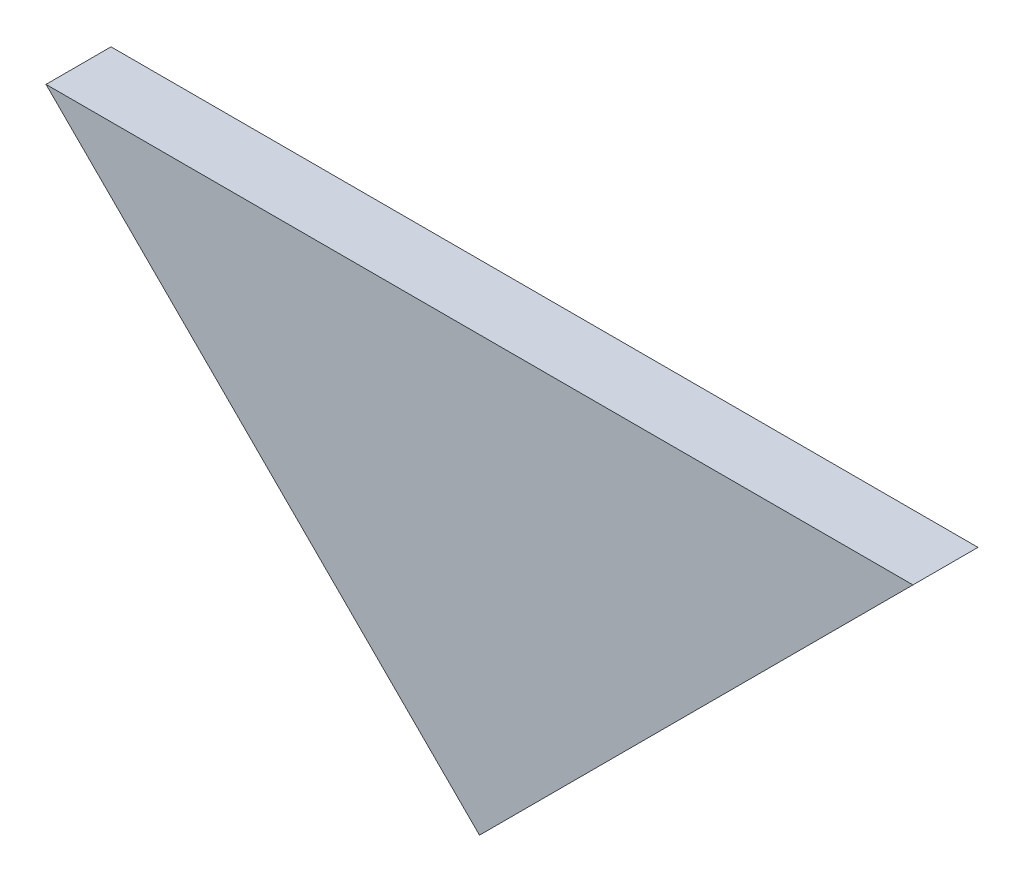
ISO-10303-21;
HEADER;
FILE_DESCRIPTION(('STEP AP214'),'2;1');
FILE_NAME('part.step','',(''),(''),'','','');
FILE_SCHEMA(('AUTOMOTIVE_DESIGN { 1 0 10303 214 1 1 1 1 }'));
ENDSEC;
DATA;
#1=APPLICATION_CONTEXT('core data for automotive mechanical design processes');
#2=APPLICATION_PROTOCOL_DEFINITION('international standard','automotive_design',2000,#1);
#3=PRODUCT_CONTEXT('',#1,'mechanical');
#4=PRODUCT('Part','Part','',(#3));
#5=PRODUCT_RELATED_PRODUCT_CATEGORY('part','',(#4));
#6=PRODUCT_DEFINITION_FORMATION('','',#4);
#7=PRODUCT_DEFINITION_CONTEXT('part definition',#1,'design');
#8=PRODUCT_DEFINITION('design','',#6,#7);
#9=PRODUCT_DEFINITION_SHAPE('','',#8);
#10=(LENGTH_UNIT() NAMED_UNIT(*) SI_UNIT(.MILLI.,.METRE.));
#11=(NAMED_UNIT(*) PLANE_ANGLE_UNIT() SI_UNIT($,.RADIAN.));
#12=(NAMED_UNIT(*) SI_UNIT($,.STERADIAN.) SOLID_ANGLE_UNIT());
#13=UNCERTAINTY_MEASURE_WITH_UNIT(LENGTH_MEASURE(1.E-05),#10,'distance_accuracy_value','');
#14=(GEOMETRIC_REPRESENTATION_CONTEXT(3) GLOBAL_UNCERTAINTY_ASSIGNED_CONTEXT((#13)) GLOBAL_UNIT_ASSIGNED_CONTEXT((#10,
#11,#12)) REPRESENTATION_CONTEXT('',''));
#15=CARTESIAN_POINT('',(0.,0.,0.));
#16=DIRECTION('',(0.,0.,1.));
#17=DIRECTION('',(1.,0.,0.));
#18=AXIS2_PLACEMENT_3D('',#15,#16,#17);
#19=CARTESIAN_POINT('',(0.,0.,6.));
#20=DIRECTION('',(-0.707106781186549,0.707106781186546,0.));
#21=DIRECTION('',(-0.707106781186546,-0.707106781186549,0.));
#22=AXIS2_PLACEMENT_3D('',#19,#20,#21);
#23=PLANE('',#22);
#24=DIRECTION('',(0.707106781186546,0.707106781186549,0.));
#25=VECTOR('',#24,1.);
#26=CARTESIAN_POINT('',(0.,0.,0.));
#27=LINE('',#26,#25);
#28=CARTESIAN_POINT('',(0.,0.,0.));
#29=VERTEX_POINT('',#28);
#30=CARTESIAN_POINT('',(39.9999999999999,40.,0.));
#31=VERTEX_POINT('',#30);
#32=EDGE_CURVE('E89',#29,#31,#27,.T.);
#33=ORIENTED_EDGE('',*,*,#32,.T.);
#34=DIRECTION('',(0.,0.,-1.));
#35=VECTOR('',#34,1.);
#36=CARTESIAN_POINT('',(39.9999999999999,40.,6.));
#37=LINE('',#36,#35);
#38=CARTESIAN_POINT('',(39.9999999999999,40.,6.));
#39=VERTEX_POINT('',#38);
#40=EDGE_CURVE('E11',#39,#31,#37,.T.);
#41=ORIENTED_EDGE('',*,*,#40,.F.);
#42=DIRECTION('',(0.707106781186546,0.707106781186549,0.));
#43=VECTOR('',#42,1.);
#44=CARTESIAN_POINT('',(0.,0.,6.));
#45=LINE('',#44,#43);
#46=CARTESIAN_POINT('',(0.,0.,6.));
#47=VERTEX_POINT('',#46);
#48=EDGE_CURVE('E81',#47,#39,#45,.T.);
#49=ORIENTED_EDGE('',*,*,#48,.F.);
#50=DIRECTION('',(0.,0.,-1.));
#51=VECTOR('',#50,1.);
#52=CARTESIAN_POINT('',(0.,0.,6.));
#53=LINE('',#52,#51);
#54=EDGE_CURVE('E90',#47,#29,#53,.T.);
#55=ORIENTED_EDGE('',*,*,#54,.T.);
#56=EDGE_LOOP('',(#33,#41,#49,#55));
#57=FACE_BOUND('',#56,.T.);
#58=ADVANCED_FACE('F39',(#57),#23,.F.);
#59=CARTESIAN_POINT('',(39.9999999999999,40.,6.));
#60=DIRECTION('',(0.,-1.,0.));
#61=DIRECTION('',(0.,0.,-1.));
#62=AXIS2_PLACEMENT_3D('',#59,#60,#61);
#63=PLANE('',#62);
#64=DIRECTION('',(-1.,0.,0.));
#65=VECTOR('',#64,1.);
#66=CARTESIAN_POINT('',(39.9999999999999,40.,0.));
#67=LINE('',#66,#65);
#68=CARTESIAN_POINT('',(-39.9999999999999,40.,0.));
#69=VERTEX_POINT('',#68);
#70=EDGE_CURVE('E68',#31,#69,#67,.T.);
#71=ORIENTED_EDGE('',*,*,#70,.T.);
#72=DIRECTION('',(0.,0.,-1.));
#73=VECTOR('',#72,1.);
#74=CARTESIAN_POINT('',(-39.9999999999999,40.,6.));
#75=LINE('',#74,#73);
#76=CARTESIAN_POINT('',(-39.9999999999999,40.,6.));
#77=VERTEX_POINT('',#76);
#78=EDGE_CURVE('E48',#77,#69,#75,.T.);
#79=ORIENTED_EDGE('',*,*,#78,.F.);
#80=DIRECTION('',(-1.,0.,0.));
#81=VECTOR('',#80,1.);
#82=CARTESIAN_POINT('',(39.9999999999999,40.,6.));
#83=LINE('',#82,#81);
#84=EDGE_CURVE('E76',#39,#77,#83,.T.);
#85=ORIENTED_EDGE('',*,*,#84,.F.);
#86=ORIENTED_EDGE('',*,*,#40,.T.);
#87=EDGE_LOOP('',(#71,#79,#85,#86));
#88=FACE_BOUND('',#87,.T.);
#89=ADVANCED_FACE('F77',(#88),#63,.F.);
#90=CARTESIAN_POINT('',(-39.9999999999999,40.,6.));
#91=DIRECTION('',(0.707106781186549,0.707106781186546,0.));
#92=DIRECTION('',(-0.707106781186546,0.707106781186549,0.));
#93=AXIS2_PLACEMENT_3D('',#90,#91,#92);
#94=PLANE('',#93);
#95=DIRECTION('',(0.707106781186546,-0.707106781186549,0.));
#96=VECTOR('',#95,1.);
#97=CARTESIAN_POINT('',(-39.9999999999999,40.,0.));
#98=LINE('',#97,#96);
#99=EDGE_CURVE('E73',#69,#29,#98,.T.);
#100=ORIENTED_EDGE('',*,*,#99,.T.);
#101=ORIENTED_EDGE('',*,*,#54,.F.);
#102=DIRECTION('',(0.707106781186546,-0.707106781186549,0.));
#103=VECTOR('',#102,1.);
#104=CARTESIAN_POINT('',(-39.9999999999999,40.,6.));
#105=LINE('',#104,#103);
#106=EDGE_CURVE('E56',#77,#47,#105,.T.);
#107=ORIENTED_EDGE('',*,*,#106,.F.);
#108=ORIENTED_EDGE('',*,*,#78,.T.);
#109=EDGE_LOOP('',(#100,#101,#107,#108));
#110=FACE_BOUND('',#109,.T.);
#111=ADVANCED_FACE('F102',(#110),#94,.F.);
#112=CARTESIAN_POINT('',(0.,0.,6.));
#113=DIRECTION('',(0.,0.,-1.));
#114=DIRECTION('',(-1.,0.,0.));
#115=AXIS2_PLACEMENT_3D('',#112,#113,#114);
#116=PLANE('',#115);
#117=ORIENTED_EDGE('',*,*,#48,.T.);
#118=ORIENTED_EDGE('',*,*,#84,.T.);
#119=ORIENTED_EDGE('',*,*,#106,.T.);
#120=EDGE_LOOP('',(#117,#118,#119));
#121=FACE_BOUND('',#120,.T.);
#122=ADVANCED_FACE('F84',(#121),#116,.F.);
#123=CARTESIAN_POINT('',(0.,0.,0.));
#124=DIRECTION('',(0.,0.,-1.));
#125=DIRECTION('',(-1.,0.,0.));
#126=AXIS2_PLACEMENT_3D('',#123,#124,#125);
#127=PLANE('',#126);
#128=ORIENTED_EDGE('',*,*,#32,.F.);
#129=ORIENTED_EDGE('',*,*,#99,.F.);
#130=ORIENTED_EDGE('',*,*,#70,.F.);
#131=EDGE_LOOP('',(#128,#129,#130));
#132=FACE_BOUND('',#131,.T.);
#133=ADVANCED_FACE('F103',(#132),#127,.T.);
#134=CLOSED_SHELL('',(#58,#89,#111,#122,#133));
#135=MANIFOLD_SOLID_BREP('B2',#134);
#136=ADVANCED_BREP_SHAPE_REPRESENTATION('',(#18,#135),#14);
#137=SHAPE_DEFINITION_REPRESENTATION(#9,#136);
ENDSEC;
END-ISO-10303-21;
